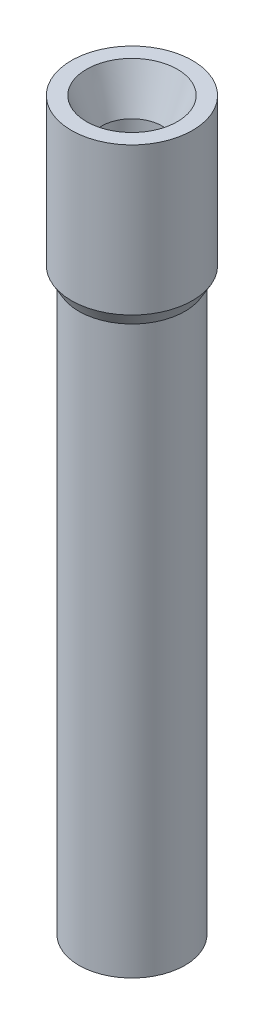
ISO-10303-21;
HEADER;
FILE_DESCRIPTION(('STEP AP214'),'2;1');
FILE_NAME('part.step','',(''),(''),'','','');
FILE_SCHEMA(('AUTOMOTIVE_DESIGN { 1 0 10303 214 1 1 1 1 }'));
ENDSEC;
DATA;
#1=APPLICATION_CONTEXT('core data for automotive mechanical design processes');
#2=APPLICATION_PROTOCOL_DEFINITION('international standard','automotive_design',2000,#1);
#3=PRODUCT_CONTEXT('',#1,'mechanical');
#4=PRODUCT('Part','Part','',(#3));
#5=PRODUCT_RELATED_PRODUCT_CATEGORY('part','',(#4));
#6=PRODUCT_DEFINITION_FORMATION('','',#4);
#7=PRODUCT_DEFINITION_CONTEXT('part definition',#1,'design');
#8=PRODUCT_DEFINITION('design','',#6,#7);
#9=PRODUCT_DEFINITION_SHAPE('','',#8);
#10=(LENGTH_UNIT() NAMED_UNIT(*) SI_UNIT(.MILLI.,.METRE.));
#11=(NAMED_UNIT(*) PLANE_ANGLE_UNIT() SI_UNIT($,.RADIAN.));
#12=(NAMED_UNIT(*) SI_UNIT($,.STERADIAN.) SOLID_ANGLE_UNIT());
#13=UNCERTAINTY_MEASURE_WITH_UNIT(LENGTH_MEASURE(1.E-05),#10,'distance_accuracy_value','');
#14=(GEOMETRIC_REPRESENTATION_CONTEXT(3) GLOBAL_UNCERTAINTY_ASSIGNED_CONTEXT((#13)) GLOBAL_UNIT_ASSIGNED_CONTEXT((#10,
#11,#12)) REPRESENTATION_CONTEXT('',''));
#15=CARTESIAN_POINT('',(0.,0.,0.));
#16=DIRECTION('',(0.,0.,1.));
#17=DIRECTION('',(1.,0.,0.));
#18=AXIS2_PLACEMENT_3D('',#15,#16,#17);
#19=CARTESIAN_POINT('',(0.,8.,0.));
#20=DIRECTION('',(0.,-1.,0.));
#21=DIRECTION('',(0.,0.,-1.));
#22=AXIS2_PLACEMENT_3D('',#19,#20,#21);
#23=CYLINDRICAL_SURFACE('',#22,4.);
#24=CARTESIAN_POINT('',(0.,-1.73205080756892,0.));
#25=DIRECTION('',(0.,1.,0.));
#26=DIRECTION('',(0.,0.,1.));
#27=AXIS2_PLACEMENT_3D('',#24,#25,#26);
#28=CIRCLE('',#27,4.);
#29=CARTESIAN_POINT('',(0.,-1.73205080756892,4.));
#30=VERTEX_POINT('',#29);
#31=EDGE_CURVE('E48',#30,#30,#28,.T.);
#32=ORIENTED_EDGE('',*,*,#31,.T.);
#33=EDGE_LOOP('',(#32));
#34=FACE_BOUND('',#33,.T.);
#35=CARTESIAN_POINT('',(0.,8.,0.));
#36=DIRECTION('',(0.,1.,0.));
#37=DIRECTION('',(0.,0.,1.));
#38=AXIS2_PLACEMENT_3D('',#35,#36,#37);
#39=CIRCLE('',#38,4.);
#40=CARTESIAN_POINT('',(0.,8.,4.));
#41=VERTEX_POINT('',#40);
#42=EDGE_CURVE('E57',#41,#41,#39,.T.);
#43=ORIENTED_EDGE('',*,*,#42,.F.);
#44=EDGE_LOOP('',(#43));
#45=FACE_BOUND('',#44,.T.);
#46=ADVANCED_FACE('F36',(#34,#45),#23,.T.);
#47=CARTESIAN_POINT('',(0.,8.,0.));
#48=DIRECTION('',(0.,1.,0.));
#49=DIRECTION('',(0.,0.,1.));
#50=AXIS2_PLACEMENT_3D('',#47,#48,#49);
#51=PLANE('',#50);
#52=CARTESIAN_POINT('',(0.,8.,0.));
#53=DIRECTION('',(0.,1.,0.));
#54=DIRECTION('',(0.,0.,1.));
#55=AXIS2_PLACEMENT_3D('',#52,#53,#54);
#56=CIRCLE('',#55,3.);
#57=CARTESIAN_POINT('',(0.,8.,3.));
#58=VERTEX_POINT('',#57);
#59=EDGE_CURVE('E10',#58,#58,#56,.F.);
#60=ORIENTED_EDGE('',*,*,#59,.T.);
#61=EDGE_LOOP('',(#60));
#62=FACE_BOUND('',#61,.T.);
#63=ORIENTED_EDGE('',*,*,#42,.T.);
#64=EDGE_LOOP('',(#63));
#65=FACE_BOUND('',#64,.T.);
#66=ADVANCED_FACE('F78',(#62,#65),#51,.T.);
#67=CARTESIAN_POINT('',(0.,-40.,0.));
#68=DIRECTION('',(0.,1.,0.));
#69=DIRECTION('',(0.,0.,1.));
#70=AXIS2_PLACEMENT_3D('',#67,#68,#69);
#71=CYLINDRICAL_SURFACE('',#70,3.5);
#72=CARTESIAN_POINT('',(0.,-2.59807621135337,0.));
#73=DIRECTION('',(0.,1.,0.));
#74=DIRECTION('',(0.,0.,1.));
#75=AXIS2_PLACEMENT_3D('',#72,#73,#74);
#76=CIRCLE('',#75,3.5);
#77=CARTESIAN_POINT('',(0.,-2.59807621135337,3.5));
#78=VERTEX_POINT('',#77);
#79=EDGE_CURVE('E52',#78,#78,#76,.F.);
#80=ORIENTED_EDGE('',*,*,#79,.T.);
#81=EDGE_LOOP('',(#80));
#82=FACE_BOUND('',#81,.T.);
#83=CARTESIAN_POINT('',(0.,-40.,0.));
#84=DIRECTION('',(0.,-1.,0.));
#85=DIRECTION('',(0.,0.,-1.));
#86=AXIS2_PLACEMENT_3D('',#83,#84,#85);
#87=CIRCLE('',#86,3.5);
#88=CARTESIAN_POINT('',(0.,-40.,-3.5));
#89=VERTEX_POINT('',#88);
#90=EDGE_CURVE('E60',#89,#89,#87,.T.);
#91=ORIENTED_EDGE('',*,*,#90,.F.);
#92=EDGE_LOOP('',(#91));
#93=FACE_BOUND('',#92,.T.);
#94=ADVANCED_FACE('F73',(#82,#93),#71,.T.);
#95=CARTESIAN_POINT('',(0.,-40.,0.));
#96=DIRECTION('',(0.,-1.,0.));
#97=DIRECTION('',(0.,0.,-1.));
#98=AXIS2_PLACEMENT_3D('',#95,#96,#97);
#99=PLANE('',#98);
#100=CARTESIAN_POINT('',(0.,-40.,0.));
#101=DIRECTION('',(0.,-1.,0.));
#102=DIRECTION('',(0.,0.,-1.));
#103=AXIS2_PLACEMENT_3D('',#100,#101,#102);
#104=CIRCLE('',#103,2.);
#105=CARTESIAN_POINT('',(0.,-40.,-2.));
#106=VERTEX_POINT('',#105);
#107=EDGE_CURVE('E63',#106,#106,#104,.T.);
#108=ORIENTED_EDGE('',*,*,#107,.F.);
#109=EDGE_LOOP('',(#108));
#110=FACE_BOUND('',#109,.T.);
#111=ORIENTED_EDGE('',*,*,#90,.T.);
#112=EDGE_LOOP('',(#111));
#113=FACE_BOUND('',#112,.T.);
#114=ADVANCED_FACE('F69',(#110,#113),#99,.T.);
#115=CARTESIAN_POINT('',(0.,-2.59807621135337,0.));
#116=DIRECTION('',(0.,1.,0.));
#117=DIRECTION('',(0.,0.,1.));
#118=AXIS2_PLACEMENT_3D('',#115,#116,#117);
#119=CONICAL_SURFACE('',#118,3.5,0.523598775598295);
#120=ORIENTED_EDGE('',*,*,#31,.F.);
#121=EDGE_LOOP('',(#120));
#122=FACE_BOUND('',#121,.T.);
#123=ORIENTED_EDGE('',*,*,#79,.F.);
#124=EDGE_LOOP('',(#123));
#125=FACE_BOUND('',#124,.T.);
#126=ADVANCED_FACE('F72',(#122,#125),#119,.T.);
#127=CARTESIAN_POINT('',(0.,61.0000000000001,0.));
#128=DIRECTION('',(0.,-1.,0.));
#129=DIRECTION('',(0.,0.,-1.));
#130=AXIS2_PLACEMENT_3D('',#127,#128,#129);
#131=CYLINDRICAL_SURFACE('',#130,2.);
#132=CARTESIAN_POINT('',(0.,5.25252258054538,0.));
#133=DIRECTION('',(0.,1.,0.));
#134=DIRECTION('',(0.,0.,1.));
#135=AXIS2_PLACEMENT_3D('',#132,#133,#134);
#136=CIRCLE('',#135,2.);
#137=CARTESIAN_POINT('',(0.,5.25252258054538,2.));
#138=VERTEX_POINT('',#137);
#139=EDGE_CURVE('E44',#138,#138,#136,.T.);
#140=ORIENTED_EDGE('',*,*,#139,.T.);
#141=EDGE_LOOP('',(#140));
#142=FACE_BOUND('',#141,.T.);
#143=ORIENTED_EDGE('',*,*,#107,.T.);
#144=EDGE_LOOP('',(#143));
#145=FACE_BOUND('',#144,.T.);
#146=ADVANCED_FACE('F67',(#142,#145),#131,.F.);
#147=CARTESIAN_POINT('',(0.,5.25252258054538,0.));
#148=DIRECTION('',(0.,1.,0.));
#149=DIRECTION('',(0.,0.,1.));
#150=AXIS2_PLACEMENT_3D('',#147,#148,#149);
#151=CONICAL_SURFACE('',#150,2.,0.349065850398867);
#152=ORIENTED_EDGE('',*,*,#59,.F.);
#153=EDGE_LOOP('',(#152));
#154=FACE_BOUND('',#153,.T.);
#155=ORIENTED_EDGE('',*,*,#139,.F.);
#156=EDGE_LOOP('',(#155));
#157=FACE_BOUND('',#156,.T.);
#158=ADVANCED_FACE('F39',(#154,#157),#151,.F.);
#159=CLOSED_SHELL('',(#46,#66,#94,#114,#126,#146,#158));
#160=MANIFOLD_SOLID_BREP('B2',#159);
#161=ADVANCED_BREP_SHAPE_REPRESENTATION('',(#18,#160),#14);
#162=SHAPE_DEFINITION_REPRESENTATION(#9,#161);
ENDSEC;
END-ISO-10303-21;
